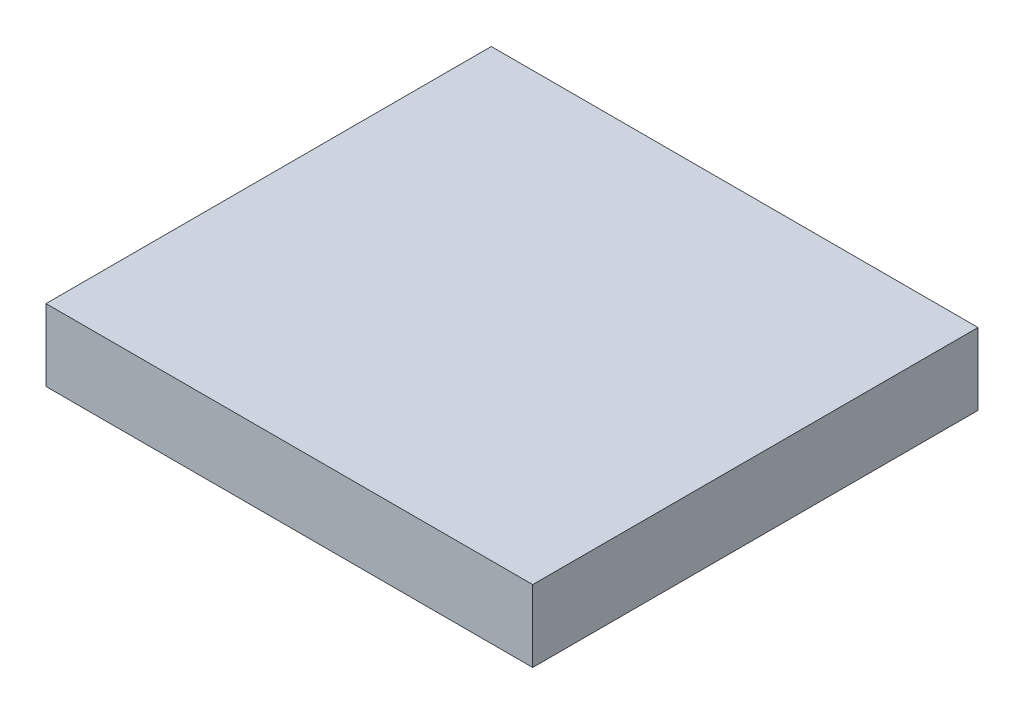
ISO-10303-21;
HEADER;
FILE_DESCRIPTION(('STEP AP214'),'2;1');
FILE_NAME('part.step','',(''),(''),'','','');
FILE_SCHEMA(('AUTOMOTIVE_DESIGN { 1 0 10303 214 1 1 1 1 }'));
ENDSEC;
DATA;
#1=APPLICATION_CONTEXT('core data for automotive mechanical design processes');
#2=APPLICATION_PROTOCOL_DEFINITION('international standard','automotive_design',2000,#1);
#3=PRODUCT_CONTEXT('',#1,'mechanical');
#4=PRODUCT('Part','Part','',(#3));
#5=PRODUCT_RELATED_PRODUCT_CATEGORY('part','',(#4));
#6=PRODUCT_DEFINITION_FORMATION('','',#4);
#7=PRODUCT_DEFINITION_CONTEXT('part definition',#1,'design');
#8=PRODUCT_DEFINITION('design','',#6,#7);
#9=PRODUCT_DEFINITION_SHAPE('','',#8);
#10=(LENGTH_UNIT() NAMED_UNIT(*) SI_UNIT(.MILLI.,.METRE.));
#11=(NAMED_UNIT(*) PLANE_ANGLE_UNIT() SI_UNIT($,.RADIAN.));
#12=(NAMED_UNIT(*) SI_UNIT($,.STERADIAN.) SOLID_ANGLE_UNIT());
#13=UNCERTAINTY_MEASURE_WITH_UNIT(LENGTH_MEASURE(1.E-05),#10,'distance_accuracy_value','');
#14=(GEOMETRIC_REPRESENTATION_CONTEXT(3) GLOBAL_UNCERTAINTY_ASSIGNED_CONTEXT((#13)) GLOBAL_UNIT_ASSIGNED_CONTEXT((#10,
#11,#12)) REPRESENTATION_CONTEXT('',''));
#15=CARTESIAN_POINT('',(0.,0.,0.));
#16=DIRECTION('',(0.,0.,1.));
#17=DIRECTION('',(1.,0.,0.));
#18=AXIS2_PLACEMENT_3D('',#15,#16,#17);
#19=CARTESIAN_POINT('',(33.8815114492466,10.,31.));
#20=DIRECTION('',(-1.,0.,0.));
#21=DIRECTION('',(0.,0.,1.));
#22=AXIS2_PLACEMENT_3D('',#19,#20,#21);
#23=PLANE('',#22);
#24=DIRECTION('',(0.,0.,-1.));
#25=VECTOR('',#24,1.);
#26=CARTESIAN_POINT('',(33.8815114492466,0.,31.));
#27=LINE('',#26,#25);
#28=CARTESIAN_POINT('',(33.8815114492466,0.,31.));
#29=VERTEX_POINT('',#28);
#30=CARTESIAN_POINT('',(33.8815114492466,0.,-31.));
#31=VERTEX_POINT('',#30);
#32=EDGE_CURVE('E94',#29,#31,#27,.T.);
#33=ORIENTED_EDGE('',*,*,#32,.T.);
#34=DIRECTION('',(0.,-1.,0.));
#35=VECTOR('',#34,1.);
#36=CARTESIAN_POINT('',(33.8815114492466,10.,-31.));
#37=LINE('',#36,#35);
#38=CARTESIAN_POINT('',(33.8815114492466,10.,-31.));
#39=VERTEX_POINT('',#38);
#40=EDGE_CURVE('E11',#39,#31,#37,.T.);
#41=ORIENTED_EDGE('',*,*,#40,.F.);
#42=DIRECTION('',(0.,0.,-1.));
#43=VECTOR('',#42,1.);
#44=CARTESIAN_POINT('',(33.8815114492466,10.,31.));
#45=LINE('',#44,#43);
#46=CARTESIAN_POINT('',(33.8815114492466,10.,31.));
#47=VERTEX_POINT('',#46);
#48=EDGE_CURVE('E82',#47,#39,#45,.T.);
#49=ORIENTED_EDGE('',*,*,#48,.F.);
#50=DIRECTION('',(0.,-1.,0.));
#51=VECTOR('',#50,1.);
#52=CARTESIAN_POINT('',(33.8815114492466,10.,31.));
#53=LINE('',#52,#51);
#54=EDGE_CURVE('E90',#47,#29,#53,.T.);
#55=ORIENTED_EDGE('',*,*,#54,.T.);
#56=EDGE_LOOP('',(#33,#41,#49,#55));
#57=FACE_BOUND('',#56,.T.);
#58=ADVANCED_FACE('F31',(#57),#23,.F.);
#59=CARTESIAN_POINT('',(-33.8815114492466,10.,-31.));
#60=DIRECTION('',(0.,0.,1.));
#61=DIRECTION('',(1.,0.,0.));
#62=AXIS2_PLACEMENT_3D('',#59,#60,#61);
#63=PLANE('',#62);
#64=DIRECTION('',(-1.,0.,0.));
#65=VECTOR('',#64,1.);
#66=CARTESIAN_POINT('',(-33.8815114492466,0.,-31.));
#67=LINE('',#66,#65);
#68=CARTESIAN_POINT('',(-33.8815114492466,0.,-31.));
#69=VERTEX_POINT('',#68);
#70=EDGE_CURVE('E86',#31,#69,#67,.T.);
#71=ORIENTED_EDGE('',*,*,#70,.T.);
#72=DIRECTION('',(0.,-1.,0.));
#73=VECTOR('',#72,1.);
#74=CARTESIAN_POINT('',(-33.8815114492466,10.,-31.));
#75=LINE('',#74,#73);
#76=CARTESIAN_POINT('',(-33.8815114492466,10.,-31.));
#77=VERTEX_POINT('',#76);
#78=EDGE_CURVE('E39',#77,#69,#75,.T.);
#79=ORIENTED_EDGE('',*,*,#78,.F.);
#80=DIRECTION('',(-1.,0.,0.));
#81=VECTOR('',#80,1.);
#82=CARTESIAN_POINT('',(-33.8815114492466,10.,-31.));
#83=LINE('',#82,#81);
#84=EDGE_CURVE('E77',#39,#77,#83,.T.);
#85=ORIENTED_EDGE('',*,*,#84,.F.);
#86=ORIENTED_EDGE('',*,*,#40,.T.);
#87=EDGE_LOOP('',(#71,#79,#85,#86));
#88=FACE_BOUND('',#87,.T.);
#89=ADVANCED_FACE('F85',(#88),#63,.F.);
#90=CARTESIAN_POINT('',(-33.8815114492466,10.,31.));
#91=DIRECTION('',(1.,0.,0.));
#92=DIRECTION('',(0.,0.,-1.));
#93=AXIS2_PLACEMENT_3D('',#90,#91,#92);
#94=PLANE('',#93);
#95=DIRECTION('',(0.,0.,1.));
#96=VECTOR('',#95,1.);
#97=CARTESIAN_POINT('',(-33.8815114492466,0.,31.));
#98=LINE('',#97,#96);
#99=CARTESIAN_POINT('',(-33.8815114492466,0.,31.));
#100=VERTEX_POINT('',#99);
#101=EDGE_CURVE('E64',#69,#100,#98,.T.);
#102=ORIENTED_EDGE('',*,*,#101,.T.);
#103=DIRECTION('',(0.,-1.,0.));
#104=VECTOR('',#103,1.);
#105=CARTESIAN_POINT('',(-33.8815114492466,10.,31.));
#106=LINE('',#105,#104);
#107=CARTESIAN_POINT('',(-33.8815114492466,10.,31.));
#108=VERTEX_POINT('',#107);
#109=EDGE_CURVE('E87',#108,#100,#106,.T.);
#110=ORIENTED_EDGE('',*,*,#109,.F.);
#111=DIRECTION('',(0.,0.,1.));
#112=VECTOR('',#111,1.);
#113=CARTESIAN_POINT('',(-33.8815114492466,10.,31.));
#114=LINE('',#113,#112);
#115=EDGE_CURVE('E80',#77,#108,#114,.T.);
#116=ORIENTED_EDGE('',*,*,#115,.F.);
#117=ORIENTED_EDGE('',*,*,#78,.T.);
#118=EDGE_LOOP('',(#102,#110,#116,#117));
#119=FACE_BOUND('',#118,.T.);
#120=ADVANCED_FACE('F88',(#119),#94,.F.);
#121=CARTESIAN_POINT('',(-33.8815114492466,10.,31.));
#122=DIRECTION('',(0.,0.,-1.));
#123=DIRECTION('',(-1.,0.,0.));
#124=AXIS2_PLACEMENT_3D('',#121,#122,#123);
#125=PLANE('',#124);
#126=DIRECTION('',(1.,0.,0.));
#127=VECTOR('',#126,1.);
#128=CARTESIAN_POINT('',(-33.8815114492466,0.,31.));
#129=LINE('',#128,#127);
#130=EDGE_CURVE('E70',#100,#29,#129,.T.);
#131=ORIENTED_EDGE('',*,*,#130,.T.);
#132=ORIENTED_EDGE('',*,*,#54,.F.);
#133=DIRECTION('',(1.,0.,0.));
#134=VECTOR('',#133,1.);
#135=CARTESIAN_POINT('',(-33.8815114492466,10.,31.));
#136=LINE('',#135,#134);
#137=EDGE_CURVE('E47',#108,#47,#136,.T.);
#138=ORIENTED_EDGE('',*,*,#137,.F.);
#139=ORIENTED_EDGE('',*,*,#109,.T.);
#140=EDGE_LOOP('',(#131,#132,#138,#139));
#141=FACE_BOUND('',#140,.T.);
#142=ADVANCED_FACE('F101',(#141),#125,.F.);
#143=CARTESIAN_POINT('',(33.8815114492466,10.,-31.));
#144=DIRECTION('',(0.,-1.,0.));
#145=DIRECTION('',(0.,0.,-1.));
#146=AXIS2_PLACEMENT_3D('',#143,#144,#145);
#147=PLANE('',#146);
#148=ORIENTED_EDGE('',*,*,#48,.T.);
#149=ORIENTED_EDGE('',*,*,#84,.T.);
#150=ORIENTED_EDGE('',*,*,#115,.T.);
#151=ORIENTED_EDGE('',*,*,#137,.T.);
#152=EDGE_LOOP('',(#148,#149,#150,#151));
#153=FACE_BOUND('',#152,.T.);
#154=ADVANCED_FACE('F78',(#153),#147,.F.);
#155=CARTESIAN_POINT('',(33.8815114492466,0.,-31.));
#156=DIRECTION('',(0.,-1.,0.));
#157=DIRECTION('',(0.,0.,-1.));
#158=AXIS2_PLACEMENT_3D('',#155,#156,#157);
#159=PLANE('',#158);
#160=ORIENTED_EDGE('',*,*,#32,.F.);
#161=ORIENTED_EDGE('',*,*,#130,.F.);
#162=ORIENTED_EDGE('',*,*,#101,.F.);
#163=ORIENTED_EDGE('',*,*,#70,.F.);
#164=EDGE_LOOP('',(#160,#161,#162,#163));
#165=FACE_BOUND('',#164,.T.);
#166=ADVANCED_FACE('F104',(#165),#159,.T.);
#167=CLOSED_SHELL('',(#58,#89,#120,#142,#154,#166));
#168=MANIFOLD_SOLID_BREP('B2',#167);
#169=ADVANCED_BREP_SHAPE_REPRESENTATION('',(#18,#168),#14);
#170=SHAPE_DEFINITION_REPRESENTATION(#9,#169);
ENDSEC;
END-ISO-10303-21;
